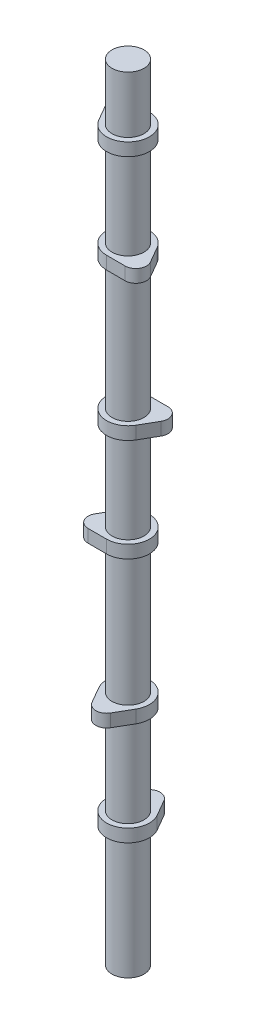
ISO-10303-21;
HEADER;
FILE_DESCRIPTION(('STEP AP214'),'2;1');
FILE_NAME('part.step','',(''),(''),'','','');
FILE_SCHEMA(('AUTOMOTIVE_DESIGN { 1 0 10303 214 1 1 1 1 }'));
ENDSEC;
DATA;
#1=APPLICATION_CONTEXT('core data for automotive mechanical design processes');
#2=APPLICATION_PROTOCOL_DEFINITION('international standard','automotive_design',2000,#1);
#3=PRODUCT_CONTEXT('',#1,'mechanical');
#4=PRODUCT('Part','Part','',(#3));
#5=PRODUCT_RELATED_PRODUCT_CATEGORY('part','',(#4));
#6=PRODUCT_DEFINITION_FORMATION('','',#4);
#7=PRODUCT_DEFINITION_CONTEXT('part definition',#1,'design');
#8=PRODUCT_DEFINITION('design','',#6,#7);
#9=PRODUCT_DEFINITION_SHAPE('','',#8);
#10=(LENGTH_UNIT() NAMED_UNIT(*) SI_UNIT(.MILLI.,.METRE.));
#11=(NAMED_UNIT(*) PLANE_ANGLE_UNIT() SI_UNIT($,.RADIAN.));
#12=(NAMED_UNIT(*) SI_UNIT($,.STERADIAN.) SOLID_ANGLE_UNIT());
#13=UNCERTAINTY_MEASURE_WITH_UNIT(LENGTH_MEASURE(1.E-05),#10,'distance_accuracy_value','');
#14=(GEOMETRIC_REPRESENTATION_CONTEXT(3) GLOBAL_UNCERTAINTY_ASSIGNED_CONTEXT((#13)) GLOBAL_UNIT_ASSIGNED_CONTEXT((#10,
#11,#12)) REPRESENTATION_CONTEXT('',''));
#15=CARTESIAN_POINT('',(0.,0.,0.));
#16=DIRECTION('',(0.,0.,1.));
#17=DIRECTION('',(1.,0.,0.));
#18=AXIS2_PLACEMENT_3D('',#15,#16,#17);
#19=CARTESIAN_POINT('',(0.,64.77,12.7));
#20=DIRECTION('',(0.,-1.,0.));
#21=DIRECTION('',(0.,0.,1.));
#22=AXIS2_PLACEMENT_3D('',#19,#20,#21);
#23=CYLINDRICAL_SURFACE('',#22,6.35);
#24=CARTESIAN_POINT('',(0.,57.15,12.7));
#25=DIRECTION('',(0.,1.,0.));
#26=DIRECTION('',(0.,0.,-1.));
#27=AXIS2_PLACEMENT_3D('',#24,#25,#26);
#28=CIRCLE('',#27,6.35);
#29=CARTESIAN_POINT('',(-5.4992613140313,57.15,15.875));
#30=VERTEX_POINT('',#29);
#31=CARTESIAN_POINT('',(5.49926131403107,57.15,15.875));
#32=VERTEX_POINT('',#31);
#33=EDGE_CURVE('E460',#30,#32,#28,.T.);
#34=ORIENTED_EDGE('',*,*,#33,.T.);
#35=DIRECTION('',(0.,-1.,0.));
#36=VECTOR('',#35,1.);
#37=CARTESIAN_POINT('',(5.49926131403107,64.77,15.875));
#38=LINE('',#37,#36);
#39=CARTESIAN_POINT('',(5.49926131403107,64.77,15.875));
#40=VERTEX_POINT('',#39);
#41=EDGE_CURVE('E490',#40,#32,#38,.T.);
#42=ORIENTED_EDGE('',*,*,#41,.F.);
#43=CARTESIAN_POINT('',(0.,64.77,12.7));
#44=DIRECTION('',(0.,1.,0.));
#45=DIRECTION('',(0.,0.,-1.));
#46=AXIS2_PLACEMENT_3D('',#43,#44,#45);
#47=CIRCLE('',#46,6.35);
#48=CARTESIAN_POINT('',(-5.4992613140313,64.77,15.875));
#49=VERTEX_POINT('',#48);
#50=EDGE_CURVE('E461',#49,#40,#47,.T.);
#51=ORIENTED_EDGE('',*,*,#50,.F.);
#52=DIRECTION('',(0.,-1.,0.));
#53=VECTOR('',#52,1.);
#54=CARTESIAN_POINT('',(-5.4992613140313,64.77,15.875));
#55=LINE('',#54,#53);
#56=EDGE_CURVE('E471',#49,#30,#55,.T.);
#57=ORIENTED_EDGE('',*,*,#56,.T.);
#58=EDGE_LOOP('',(#34,#42,#51,#57));
#59=FACE_BOUND('',#58,.T.);
#60=ADVANCED_FACE('F41',(#59),#23,.T.);
#61=CARTESIAN_POINT('',(5.49926131403107,64.77,15.875));
#62=DIRECTION('',(-0.866025403784435,0.,-0.500000000000006));
#63=DIRECTION('',(-0.500000000000006,0.,0.866025403784435));
#64=AXIS2_PLACEMENT_3D('',#61,#62,#63);
#65=PLANE('',#64);
#66=DIRECTION('',(0.500000000000006,0.,-0.866025403784435));
#67=VECTOR('',#66,1.);
#68=CARTESIAN_POINT('',(5.49926131403107,57.15,15.875));
#69=LINE('',#68,#67);
#70=CARTESIAN_POINT('',(10.9985226280623,57.15,6.35000000000008));
#71=VERTEX_POINT('',#70);
#72=EDGE_CURVE('E475',#32,#71,#69,.T.);
#73=ORIENTED_EDGE('',*,*,#72,.T.);
#74=DIRECTION('',(0.,-1.,0.));
#75=VECTOR('',#74,1.);
#76=CARTESIAN_POINT('',(10.9985226280623,64.77,6.35000000000008));
#77=LINE('',#76,#75);
#78=CARTESIAN_POINT('',(10.9985226280623,64.77,6.35000000000008));
#79=VERTEX_POINT('',#78);
#80=EDGE_CURVE('E487',#79,#71,#77,.T.);
#81=ORIENTED_EDGE('',*,*,#80,.F.);
#82=DIRECTION('',(0.500000000000006,0.,-0.866025403784435));
#83=VECTOR('',#82,1.);
#84=CARTESIAN_POINT('',(5.49926131403107,64.77,15.875));
#85=LINE('',#84,#83);
#86=EDGE_CURVE('E91',#40,#79,#85,.T.);
#87=ORIENTED_EDGE('',*,*,#86,.F.);
#88=ORIENTED_EDGE('',*,*,#41,.T.);
#89=EDGE_LOOP('',(#73,#81,#87,#88));
#90=FACE_BOUND('',#89,.T.);
#91=ADVANCED_FACE('F511',(#90),#65,.F.);
#92=CARTESIAN_POINT('',(0.,64.77,0.));
#93=DIRECTION('',(0.,-1.,0.));
#94=DIRECTION('',(0.,0.,1.));
#95=AXIS2_PLACEMENT_3D('',#92,#93,#94);
#96=CYLINDRICAL_SURFACE('',#95,12.7);
#97=CARTESIAN_POINT('',(0.,57.15,0.));
#98=DIRECTION('',(0.,1.,0.));
#99=DIRECTION('',(0.,0.,-1.));
#100=AXIS2_PLACEMENT_3D('',#97,#98,#99);
#101=CIRCLE('',#100,12.7);
#102=CARTESIAN_POINT('',(-10.9985226280624,57.15,6.34999999999992));
#103=VERTEX_POINT('',#102);
#104=EDGE_CURVE('E77',#71,#103,#101,.T.);
#105=ORIENTED_EDGE('',*,*,#104,.T.);
#106=DIRECTION('',(0.,-1.,0.));
#107=VECTOR('',#106,1.);
#108=CARTESIAN_POINT('',(-10.9985226280624,64.77,6.34999999999992));
#109=LINE('',#108,#107);
#110=CARTESIAN_POINT('',(-10.9985226280624,64.77,6.34999999999992));
#111=VERTEX_POINT('',#110);
#112=EDGE_CURVE('E484',#111,#103,#109,.T.);
#113=ORIENTED_EDGE('',*,*,#112,.F.);
#114=CARTESIAN_POINT('',(0.,64.77,0.));
#115=DIRECTION('',(0.,1.,0.));
#116=DIRECTION('',(0.,0.,-1.));
#117=AXIS2_PLACEMENT_3D('',#114,#115,#116);
#118=CIRCLE('',#117,12.7);
#119=EDGE_CURVE('E466',#79,#111,#118,.T.);
#120=ORIENTED_EDGE('',*,*,#119,.F.);
#121=ORIENTED_EDGE('',*,*,#80,.T.);
#122=EDGE_LOOP('',(#105,#113,#120,#121));
#123=FACE_BOUND('',#122,.T.);
#124=ADVANCED_FACE('F510',(#123),#96,.T.);
#125=CARTESIAN_POINT('',(-5.4992613140313,64.77,15.875));
#126=DIRECTION('',(0.866025403784442,0.,-0.499999999999994));
#127=DIRECTION('',(-0.499999999999994,0.,-0.866025403784442));
#128=AXIS2_PLACEMENT_3D('',#125,#126,#127);
#129=PLANE('',#128);
#130=DIRECTION('',(0.499999999999994,0.,0.866025403784442));
#131=VECTOR('',#130,1.);
#132=CARTESIAN_POINT('',(-5.4992613140313,57.15,15.875));
#133=LINE('',#132,#131);
#134=EDGE_CURVE('E83',#103,#30,#133,.T.);
#135=ORIENTED_EDGE('',*,*,#134,.T.);
#136=ORIENTED_EDGE('',*,*,#56,.F.);
#137=DIRECTION('',(0.499999999999994,0.,0.866025403784442));
#138=VECTOR('',#137,1.);
#139=CARTESIAN_POINT('',(-5.4992613140313,64.77,15.875));
#140=LINE('',#139,#138);
#141=EDGE_CURVE('E59',#111,#49,#140,.T.);
#142=ORIENTED_EDGE('',*,*,#141,.F.);
#143=ORIENTED_EDGE('',*,*,#112,.T.);
#144=EDGE_LOOP('',(#135,#136,#142,#143));
#145=FACE_BOUND('',#144,.T.);
#146=ADVANCED_FACE('F508',(#145),#129,.F.);
#147=CARTESIAN_POINT('',(0.,64.77,12.7));
#148=DIRECTION('',(0.,1.,0.));
#149=DIRECTION('',(0.,0.,-1.));
#150=AXIS2_PLACEMENT_3D('',#147,#148,#149);
#151=PLANE('',#150);
#152=CARTESIAN_POINT('',(0.,64.77,0.));
#153=DIRECTION('',(0.,1.,0.));
#154=DIRECTION('',(0.,0.,1.));
#155=AXIS2_PLACEMENT_3D('',#152,#153,#154);
#156=CIRCLE('',#155,9.5);
#157=CARTESIAN_POINT('',(0.,64.77,9.5));
#158=VERTEX_POINT('',#157);
#159=EDGE_CURVE('E456',#158,#158,#156,.F.);
#160=ORIENTED_EDGE('',*,*,#159,.T.);
#161=EDGE_LOOP('',(#160));
#162=FACE_BOUND('',#161,.T.);
#163=ORIENTED_EDGE('',*,*,#50,.T.);
#164=ORIENTED_EDGE('',*,*,#86,.T.);
#165=ORIENTED_EDGE('',*,*,#119,.T.);
#166=ORIENTED_EDGE('',*,*,#141,.T.);
#167=EDGE_LOOP('',(#163,#164,#165,#166));
#168=FACE_BOUND('',#167,.T.);
#169=ADVANCED_FACE('F502',(#162,#168),#151,.T.);
#170=CARTESIAN_POINT('',(0.,57.15,12.7));
#171=DIRECTION('',(0.,1.,0.));
#172=DIRECTION('',(0.,0.,-1.));
#173=AXIS2_PLACEMENT_3D('',#170,#171,#172);
#174=PLANE('',#173);
#175=CARTESIAN_POINT('',(0.,57.15,0.));
#176=DIRECTION('',(0.,1.,0.));
#177=DIRECTION('',(0.,0.,1.));
#178=AXIS2_PLACEMENT_3D('',#175,#176,#177);
#179=CIRCLE('',#178,9.5);
#180=CARTESIAN_POINT('',(0.,57.15,9.5));
#181=VERTEX_POINT('',#180);
#182=EDGE_CURVE('E51',#181,#181,#179,.F.);
#183=ORIENTED_EDGE('',*,*,#182,.F.);
#184=EDGE_LOOP('',(#183));
#185=FACE_BOUND('',#184,.T.);
#186=ORIENTED_EDGE('',*,*,#33,.F.);
#187=ORIENTED_EDGE('',*,*,#134,.F.);
#188=ORIENTED_EDGE('',*,*,#104,.F.);
#189=ORIENTED_EDGE('',*,*,#72,.F.);
#190=EDGE_LOOP('',(#186,#187,#188,#189));
#191=FACE_BOUND('',#190,.T.);
#192=ADVANCED_FACE('F499',(#185,#191),#174,.F.);
#193=CARTESIAN_POINT('',(0.,98.425,0.));
#194=DIRECTION('',(0.,-1.,0.));
#195=DIRECTION('',(0.,0.,-1.));
#196=AXIS2_PLACEMENT_3D('',#193,#194,#195);
#197=CYLINDRICAL_SURFACE('',#196,9.5);
#198=CARTESIAN_POINT('',(0.,3.80999999999999,0.));
#199=DIRECTION('',(0.,1.,0.));
#200=DIRECTION('',(0.,0.,1.));
#201=AXIS2_PLACEMENT_3D('',#198,#199,#200);
#202=CIRCLE('',#201,9.5);
#203=CARTESIAN_POINT('',(0.,3.80999999999999,9.5));
#204=VERTEX_POINT('',#203);
#205=EDGE_CURVE('E44',#204,#204,#202,.T.);
#206=ORIENTED_EDGE('',*,*,#205,.T.);
#207=EDGE_LOOP('',(#206));
#208=FACE_BOUND('',#207,.T.);
#209=ORIENTED_EDGE('',*,*,#182,.T.);
#210=EDGE_LOOP('',(#209));
#211=FACE_BOUND('',#210,.T.);
#212=ADVANCED_FACE('F497',(#208,#211),#197,.T.);
#213=ORIENTED_EDGE('',*,*,#159,.F.);
#214=EDGE_LOOP('',(#213));
#215=FACE_BOUND('',#214,.T.);
#216=CARTESIAN_POINT('',(0.,142.24,0.));
#217=DIRECTION('',(0.,1.,0.));
#218=DIRECTION('',(0.866025403784436,0.,-0.500000000000004));
#219=AXIS2_PLACEMENT_3D('',#216,#217,#218);
#220=CIRCLE('',#219,9.5);
#221=CARTESIAN_POINT('',(8.22724133595215,142.24,-4.75000000000004));
#222=VERTEX_POINT('',#221);
#223=EDGE_CURVE('E403',#222,#222,#220,.T.);
#224=ORIENTED_EDGE('',*,*,#223,.F.);
#225=EDGE_LOOP('',(#224));
#226=FACE_BOUND('',#225,.T.);
#227=ADVANCED_FACE('F524',(#215,#226),#197,.T.);
#228=CARTESIAN_POINT('',(0.,3.81,-12.7));
#229=DIRECTION('',(0.,-1.,0.));
#230=DIRECTION('',(0.,0.,-1.));
#231=AXIS2_PLACEMENT_3D('',#228,#229,#230);
#232=CYLINDRICAL_SURFACE('',#231,6.35);
#233=CARTESIAN_POINT('',(0.,-3.81,-12.7));
#234=DIRECTION('',(0.,1.,0.));
#235=DIRECTION('',(0.,0.,1.));
#236=AXIS2_PLACEMENT_3D('',#233,#234,#235);
#237=CIRCLE('',#236,6.35);
#238=CARTESIAN_POINT('',(5.49926131403118,-3.81,-15.875));
#239=VERTEX_POINT('',#238);
#240=CARTESIAN_POINT('',(-5.49926131403118,-3.81,-15.875));
#241=VERTEX_POINT('',#240);
#242=EDGE_CURVE('E414',#239,#241,#237,.T.);
#243=ORIENTED_EDGE('',*,*,#242,.T.);
#244=DIRECTION('',(0.,-1.,0.));
#245=VECTOR('',#244,1.);
#246=CARTESIAN_POINT('',(-5.49926131403118,3.81,-15.875));
#247=LINE('',#246,#245);
#248=CARTESIAN_POINT('',(-5.49926131403118,3.81,-15.875));
#249=VERTEX_POINT('',#248);
#250=EDGE_CURVE('E452',#249,#241,#247,.T.);
#251=ORIENTED_EDGE('',*,*,#250,.F.);
#252=CARTESIAN_POINT('',(0.,3.81,-12.7));
#253=DIRECTION('',(0.,1.,0.));
#254=DIRECTION('',(0.,0.,1.));
#255=AXIS2_PLACEMENT_3D('',#252,#253,#254);
#256=CIRCLE('',#255,6.35);
#257=CARTESIAN_POINT('',(5.49926131403118,3.81,-15.875));
#258=VERTEX_POINT('',#257);
#259=EDGE_CURVE('E415',#258,#249,#256,.T.);
#260=ORIENTED_EDGE('',*,*,#259,.F.);
#261=DIRECTION('',(0.,-1.,0.));
#262=VECTOR('',#261,1.);
#263=CARTESIAN_POINT('',(5.49926131403118,3.81,-15.875));
#264=LINE('',#263,#262);
#265=EDGE_CURVE('E429',#258,#239,#264,.T.);
#266=ORIENTED_EDGE('',*,*,#265,.T.);
#267=EDGE_LOOP('',(#243,#251,#260,#266));
#268=FACE_BOUND('',#267,.T.);
#269=ADVANCED_FACE('F527',(#268),#232,.T.);
#270=CARTESIAN_POINT('',(-5.49926131403118,3.81,-15.875));
#271=DIRECTION('',(0.866025403784439,0.,0.5));
#272=DIRECTION('',(0.5,0.,-0.866025403784439));
#273=AXIS2_PLACEMENT_3D('',#270,#271,#272);
#274=PLANE('',#273);
#275=DIRECTION('',(-0.5,0.,0.866025403784439));
#276=VECTOR('',#275,1.);
#277=CARTESIAN_POINT('',(-5.49926131403118,-3.81,-15.875));
#278=LINE('',#277,#276);
#279=CARTESIAN_POINT('',(-10.9985226280624,-3.81,-6.35000000000001));
#280=VERTEX_POINT('',#279);
#281=EDGE_CURVE('E433',#241,#280,#278,.T.);
#282=ORIENTED_EDGE('',*,*,#281,.T.);
#283=DIRECTION('',(0.,-1.,0.));
#284=VECTOR('',#283,1.);
#285=CARTESIAN_POINT('',(-10.9985226280624,3.81,-6.35000000000001));
#286=LINE('',#285,#284);
#287=CARTESIAN_POINT('',(-10.9985226280624,3.81,-6.35000000000001));
#288=VERTEX_POINT('',#287);
#289=EDGE_CURVE('E448',#288,#280,#286,.T.);
#290=ORIENTED_EDGE('',*,*,#289,.F.);
#291=DIRECTION('',(-0.5,0.,0.866025403784439));
#292=VECTOR('',#291,1.);
#293=CARTESIAN_POINT('',(-5.49926131403118,3.81,-15.875));
#294=LINE('',#293,#292);
#295=EDGE_CURVE('E419',#249,#288,#294,.T.);
#296=ORIENTED_EDGE('',*,*,#295,.F.);
#297=ORIENTED_EDGE('',*,*,#250,.T.);
#298=EDGE_LOOP('',(#282,#290,#296,#297));
#299=FACE_BOUND('',#298,.T.);
#300=ADVANCED_FACE('F532',(#299),#274,.F.);
#301=CARTESIAN_POINT('',(0.,3.81,0.));
#302=DIRECTION('',(0.,-1.,0.));
#303=DIRECTION('',(0.,0.,-1.));
#304=AXIS2_PLACEMENT_3D('',#301,#302,#303);
#305=CYLINDRICAL_SURFACE('',#304,12.7);
#306=CARTESIAN_POINT('',(0.,-3.81,0.));
#307=DIRECTION('',(0.,1.,0.));
#308=DIRECTION('',(0.,0.,1.));
#309=AXIS2_PLACEMENT_3D('',#306,#307,#308);
#310=CIRCLE('',#309,12.7);
#311=CARTESIAN_POINT('',(10.9985226280624,-3.81,-6.35));
#312=VERTEX_POINT('',#311);
#313=EDGE_CURVE('E436',#280,#312,#310,.T.);
#314=ORIENTED_EDGE('',*,*,#313,.T.);
#315=DIRECTION('',(0.,-1.,0.));
#316=VECTOR('',#315,1.);
#317=CARTESIAN_POINT('',(10.9985226280624,3.81,-6.35));
#318=LINE('',#317,#316);
#319=CARTESIAN_POINT('',(10.9985226280624,3.81,-6.35));
#320=VERTEX_POINT('',#319);
#321=EDGE_CURVE('E444',#320,#312,#318,.T.);
#322=ORIENTED_EDGE('',*,*,#321,.F.);
#323=CARTESIAN_POINT('',(0.,3.81,0.));
#324=DIRECTION('',(0.,1.,0.));
#325=DIRECTION('',(0.,0.,1.));
#326=AXIS2_PLACEMENT_3D('',#323,#324,#325);
#327=CIRCLE('',#326,12.7);
#328=EDGE_CURVE('E423',#288,#320,#327,.T.);
#329=ORIENTED_EDGE('',*,*,#328,.F.);
#330=ORIENTED_EDGE('',*,*,#289,.T.);
#331=EDGE_LOOP('',(#314,#322,#329,#330));
#332=FACE_BOUND('',#331,.T.);
#333=ADVANCED_FACE('F536',(#332),#305,.T.);
#334=CARTESIAN_POINT('',(5.49926131403118,3.81,-15.875));
#335=DIRECTION('',(-0.866025403784439,0.,0.5));
#336=DIRECTION('',(0.5,0.,0.866025403784439));
#337=AXIS2_PLACEMENT_3D('',#334,#335,#336);
#338=PLANE('',#337);
#339=DIRECTION('',(-0.5,0.,-0.866025403784439));
#340=VECTOR('',#339,1.);
#341=CARTESIAN_POINT('',(5.49926131403118,-3.81,-15.875));
#342=LINE('',#341,#340);
#343=EDGE_CURVE('E420',#312,#239,#342,.T.);
#344=ORIENTED_EDGE('',*,*,#343,.T.);
#345=ORIENTED_EDGE('',*,*,#265,.F.);
#346=DIRECTION('',(-0.5,0.,-0.866025403784439));
#347=VECTOR('',#346,1.);
#348=CARTESIAN_POINT('',(5.49926131403118,3.81,-15.875));
#349=LINE('',#348,#347);
#350=EDGE_CURVE('E426',#320,#258,#349,.T.);
#351=ORIENTED_EDGE('',*,*,#350,.F.);
#352=ORIENTED_EDGE('',*,*,#321,.T.);
#353=EDGE_LOOP('',(#344,#345,#351,#352));
#354=FACE_BOUND('',#353,.T.);
#355=ADVANCED_FACE('F540',(#354),#338,.F.);
#356=CARTESIAN_POINT('',(0.,3.81,-12.7));
#357=DIRECTION('',(0.,1.,0.));
#358=DIRECTION('',(0.,0.,1.));
#359=AXIS2_PLACEMENT_3D('',#356,#357,#358);
#360=PLANE('',#359);
#361=ORIENTED_EDGE('',*,*,#205,.F.);
#362=EDGE_LOOP('',(#361));
#363=FACE_BOUND('',#362,.T.);
#364=ORIENTED_EDGE('',*,*,#259,.T.);
#365=ORIENTED_EDGE('',*,*,#295,.T.);
#366=ORIENTED_EDGE('',*,*,#328,.T.);
#367=ORIENTED_EDGE('',*,*,#350,.T.);
#368=EDGE_LOOP('',(#364,#365,#366,#367));
#369=FACE_BOUND('',#368,.T.);
#370=ADVANCED_FACE('F544',(#363,#369),#360,.T.);
#371=CARTESIAN_POINT('',(0.,-3.81,-12.7));
#372=DIRECTION('',(0.,1.,0.));
#373=DIRECTION('',(0.,0.,1.));
#374=AXIS2_PLACEMENT_3D('',#371,#372,#373);
#375=PLANE('',#374);
#376=CARTESIAN_POINT('',(0.,-3.80999999999999,0.));
#377=DIRECTION('',(0.,1.,0.));
#378=DIRECTION('',(0.,0.,1.));
#379=AXIS2_PLACEMENT_3D('',#376,#377,#378);
#380=CIRCLE('',#379,9.5);
#381=CARTESIAN_POINT('',(0.,-3.80999999999999,9.5));
#382=VERTEX_POINT('',#381);
#383=EDGE_CURVE('E11',#382,#382,#380,.T.);
#384=ORIENTED_EDGE('',*,*,#383,.T.);
#385=EDGE_LOOP('',(#384));
#386=FACE_BOUND('',#385,.T.);
#387=ORIENTED_EDGE('',*,*,#242,.F.);
#388=ORIENTED_EDGE('',*,*,#343,.F.);
#389=ORIENTED_EDGE('',*,*,#313,.F.);
#390=ORIENTED_EDGE('',*,*,#281,.F.);
#391=EDGE_LOOP('',(#387,#388,#389,#390));
#392=FACE_BOUND('',#391,.T.);
#393=ADVANCED_FACE('F546',(#386,#392),#375,.F.);
#394=ORIENTED_EDGE('',*,*,#383,.F.);
#395=EDGE_LOOP('',(#394));
#396=FACE_BOUND('',#395,.T.);
#397=CARTESIAN_POINT('',(0.,-75.565,0.));
#398=DIRECTION('',(0.,-1.,0.));
#399=DIRECTION('',(0.,0.,-1.));
#400=AXIS2_PLACEMENT_3D('',#397,#398,#399);
#401=CIRCLE('',#400,9.5);
#402=CARTESIAN_POINT('',(0.,-75.565,-9.5));
#403=VERTEX_POINT('',#402);
#404=EDGE_CURVE('E407',#403,#403,#401,.T.);
#405=ORIENTED_EDGE('',*,*,#404,.F.);
#406=EDGE_LOOP('',(#405));
#407=FACE_BOUND('',#406,.T.);
#408=ADVANCED_FACE('F529',(#396,#407),#197,.T.);
#409=CARTESIAN_POINT('',(0.,-75.565,0.));
#410=DIRECTION('',(0.,-1.,0.));
#411=DIRECTION('',(0.,0.,-1.));
#412=AXIS2_PLACEMENT_3D('',#409,#410,#411);
#413=PLANE('',#412);
#414=ORIENTED_EDGE('',*,*,#404,.T.);
#415=EDGE_LOOP('',(#414));
#416=FACE_BOUND('',#415,.T.);
#417=ADVANCED_FACE('F553',(#416),#413,.T.);
#418=CARTESIAN_POINT('',(10.9985226280624,210.82,-6.34999999999997));
#419=DIRECTION('',(0.,-1.,0.));
#420=DIRECTION('',(0.86602540378444,0.,-0.499999999999998));
#421=AXIS2_PLACEMENT_3D('',#418,#419,#420);
#422=CYLINDRICAL_SURFACE('',#421,6.35);
#423=CARTESIAN_POINT('',(10.9985226280624,203.2,-6.34999999999997));
#424=DIRECTION('',(0.,1.,0.));
#425=DIRECTION('',(-0.86602540378444,0.,0.499999999999998));
#426=AXIS2_PLACEMENT_3D('',#423,#424,#425);
#427=CIRCLE('',#426,6.35);
#428=CARTESIAN_POINT('',(16.4977839420936,203.2,-3.17499999999996));
#429=VERTEX_POINT('',#428);
#430=CARTESIAN_POINT('',(10.9985226280624,203.2,-12.7));
#431=VERTEX_POINT('',#430);
#432=EDGE_CURVE('E357',#429,#431,#427,.T.);
#433=ORIENTED_EDGE('',*,*,#432,.T.);
#434=DIRECTION('',(0.,-1.,0.));
#435=VECTOR('',#434,1.);
#436=CARTESIAN_POINT('',(10.9985226280624,210.82,-12.7));
#437=LINE('',#436,#435);
#438=CARTESIAN_POINT('',(10.9985226280624,210.82,-12.7));
#439=VERTEX_POINT('',#438);
#440=EDGE_CURVE('E395',#439,#431,#437,.T.);
#441=ORIENTED_EDGE('',*,*,#440,.F.);
#442=CARTESIAN_POINT('',(10.9985226280624,210.82,-6.34999999999997));
#443=DIRECTION('',(0.,1.,0.));
#444=DIRECTION('',(-0.86602540378444,0.,0.499999999999998));
#445=AXIS2_PLACEMENT_3D('',#442,#443,#444);
#446=CIRCLE('',#445,6.35);
#447=CARTESIAN_POINT('',(16.4977839420936,210.82,-3.17499999999996));
#448=VERTEX_POINT('',#447);
#449=EDGE_CURVE('E358',#448,#439,#446,.T.);
#450=ORIENTED_EDGE('',*,*,#449,.F.);
#451=DIRECTION('',(0.,-1.,0.));
#452=VECTOR('',#451,1.);
#453=CARTESIAN_POINT('',(16.4977839420936,210.82,-3.17499999999996));
#454=LINE('',#453,#452);
#455=EDGE_CURVE('E372',#448,#429,#454,.T.);
#456=ORIENTED_EDGE('',*,*,#455,.T.);
#457=EDGE_LOOP('',(#433,#441,#450,#456));
#458=FACE_BOUND('',#457,.T.);
#459=ADVANCED_FACE('F556',(#458),#422,.T.);
#460=CARTESIAN_POINT('',(10.9985226280624,210.82,-12.7));
#461=DIRECTION('',(0.,0.,1.));
#462=DIRECTION('',(1.,0.,0.));
#463=AXIS2_PLACEMENT_3D('',#460,#461,#462);
#464=PLANE('',#463);
#465=DIRECTION('',(-1.,0.,0.));
#466=VECTOR('',#465,1.);
#467=CARTESIAN_POINT('',(10.9985226280624,203.2,-12.7));
#468=LINE('',#467,#466);
#469=CARTESIAN_POINT('',(0.,203.2,-12.7));
#470=VERTEX_POINT('',#469);
#471=EDGE_CURVE('E376',#431,#470,#468,.T.);
#472=ORIENTED_EDGE('',*,*,#471,.T.);
#473=DIRECTION('',(0.,-1.,0.));
#474=VECTOR('',#473,1.);
#475=CARTESIAN_POINT('',(0.,210.82,-12.7));
#476=LINE('',#475,#474);
#477=CARTESIAN_POINT('',(0.,210.82,-12.7));
#478=VERTEX_POINT('',#477);
#479=EDGE_CURVE('E391',#478,#470,#476,.T.);
#480=ORIENTED_EDGE('',*,*,#479,.F.);
#481=DIRECTION('',(-1.,0.,0.));
#482=VECTOR('',#481,1.);
#483=CARTESIAN_POINT('',(10.9985226280624,210.82,-12.7));
#484=LINE('',#483,#482);
#485=EDGE_CURVE('E362',#439,#478,#484,.T.);
#486=ORIENTED_EDGE('',*,*,#485,.F.);
#487=ORIENTED_EDGE('',*,*,#440,.T.);
#488=EDGE_LOOP('',(#472,#480,#486,#487));
#489=FACE_BOUND('',#488,.T.);
#490=ADVANCED_FACE('F560',(#489),#464,.F.);
#491=CARTESIAN_POINT('',(0.,210.82,0.));
#492=DIRECTION('',(0.,-1.,0.));
#493=DIRECTION('',(0.86602540378444,0.,-0.499999999999998));
#494=AXIS2_PLACEMENT_3D('',#491,#492,#493);
#495=CYLINDRICAL_SURFACE('',#494,12.7);
#496=CARTESIAN_POINT('',(0.,203.2,0.));
#497=DIRECTION('',(0.,1.,0.));
#498=DIRECTION('',(-0.86602540378444,0.,0.499999999999998));
#499=AXIS2_PLACEMENT_3D('',#496,#497,#498);
#500=CIRCLE('',#499,12.7);
#501=CARTESIAN_POINT('',(10.9985226280624,203.2,6.35000000000003));
#502=VERTEX_POINT('',#501);
#503=EDGE_CURVE('E379',#470,#502,#500,.T.);
#504=ORIENTED_EDGE('',*,*,#503,.T.);
#505=DIRECTION('',(0.,-1.,0.));
#506=VECTOR('',#505,1.);
#507=CARTESIAN_POINT('',(10.9985226280624,210.82,6.35000000000003));
#508=LINE('',#507,#506);
#509=CARTESIAN_POINT('',(10.9985226280624,210.82,6.35000000000003));
#510=VERTEX_POINT('',#509);
#511=EDGE_CURVE('E387',#510,#502,#508,.T.);
#512=ORIENTED_EDGE('',*,*,#511,.F.);
#513=CARTESIAN_POINT('',(0.,210.82,0.));
#514=DIRECTION('',(0.,1.,0.));
#515=DIRECTION('',(-0.86602540378444,0.,0.499999999999998));
#516=AXIS2_PLACEMENT_3D('',#513,#514,#515);
#517=CIRCLE('',#516,12.7);
#518=EDGE_CURVE('E366',#478,#510,#517,.T.);
#519=ORIENTED_EDGE('',*,*,#518,.F.);
#520=ORIENTED_EDGE('',*,*,#479,.T.);
#521=EDGE_LOOP('',(#504,#512,#519,#520));
#522=FACE_BOUND('',#521,.T.);
#523=ADVANCED_FACE('F564',(#522),#495,.T.);
#524=CARTESIAN_POINT('',(16.4977839420936,210.82,-3.17499999999996));
#525=DIRECTION('',(-0.866025403784438,0.,-0.500000000000002));
#526=DIRECTION('',(-0.500000000000002,0.,0.866025403784438));
#527=AXIS2_PLACEMENT_3D('',#524,#525,#526);
#528=PLANE('',#527);
#529=DIRECTION('',(0.500000000000002,0.,-0.866025403784438));
#530=VECTOR('',#529,1.);
#531=CARTESIAN_POINT('',(16.4977839420936,203.2,-3.17499999999996));
#532=LINE('',#531,#530);
#533=EDGE_CURVE('E363',#502,#429,#532,.T.);
#534=ORIENTED_EDGE('',*,*,#533,.T.);
#535=ORIENTED_EDGE('',*,*,#455,.F.);
#536=DIRECTION('',(0.500000000000002,0.,-0.866025403784438));
#537=VECTOR('',#536,1.);
#538=CARTESIAN_POINT('',(16.4977839420936,210.82,-3.17499999999996));
#539=LINE('',#538,#537);
#540=EDGE_CURVE('E369',#510,#448,#539,.T.);
#541=ORIENTED_EDGE('',*,*,#540,.F.);
#542=ORIENTED_EDGE('',*,*,#511,.T.);
#543=EDGE_LOOP('',(#534,#535,#541,#542));
#544=FACE_BOUND('',#543,.T.);
#545=ADVANCED_FACE('F568',(#544),#528,.F.);
#546=CARTESIAN_POINT('',(10.9985226280624,210.82,-6.34999999999997));
#547=DIRECTION('',(0.,1.,0.));
#548=DIRECTION('',(-0.86602540378444,0.,0.499999999999998));
#549=AXIS2_PLACEMENT_3D('',#546,#547,#548);
#550=PLANE('',#549);
#551=CARTESIAN_POINT('',(0.,210.82,0.));
#552=DIRECTION('',(0.,1.,0.));
#553=DIRECTION('',(0.866025403784436,0.,-0.500000000000004));
#554=AXIS2_PLACEMENT_3D('',#551,#552,#553);
#555=CIRCLE('',#554,9.5);
#556=CARTESIAN_POINT('',(8.22724133595215,210.82,-4.75000000000004));
#557=VERTEX_POINT('',#556);
#558=EDGE_CURVE('E353',#557,#557,#555,.F.);
#559=ORIENTED_EDGE('',*,*,#558,.T.);
#560=EDGE_LOOP('',(#559));
#561=FACE_BOUND('',#560,.T.);
#562=ORIENTED_EDGE('',*,*,#449,.T.);
#563=ORIENTED_EDGE('',*,*,#485,.T.);
#564=ORIENTED_EDGE('',*,*,#518,.T.);
#565=ORIENTED_EDGE('',*,*,#540,.T.);
#566=EDGE_LOOP('',(#562,#563,#564,#565));
#567=FACE_BOUND('',#566,.T.);
#568=ADVANCED_FACE('F572',(#561,#567),#550,.T.);
#569=CARTESIAN_POINT('',(10.9985226280624,203.2,-6.34999999999997));
#570=DIRECTION('',(0.,1.,0.));
#571=DIRECTION('',(-0.86602540378444,0.,0.499999999999998));
#572=AXIS2_PLACEMENT_3D('',#569,#570,#571);
#573=PLANE('',#572);
#574=CARTESIAN_POINT('',(0.,203.2,0.));
#575=DIRECTION('',(0.,1.,0.));
#576=DIRECTION('',(0.866025403784436,0.,-0.500000000000004));
#577=AXIS2_PLACEMENT_3D('',#574,#575,#576);
#578=CIRCLE('',#577,9.5);
#579=CARTESIAN_POINT('',(8.22724133595215,203.2,-4.75000000000004));
#580=VERTEX_POINT('',#579);
#581=EDGE_CURVE('E399',#580,#580,#578,.F.);
#582=ORIENTED_EDGE('',*,*,#581,.F.);
#583=EDGE_LOOP('',(#582));
#584=FACE_BOUND('',#583,.T.);
#585=ORIENTED_EDGE('',*,*,#432,.F.);
#586=ORIENTED_EDGE('',*,*,#533,.F.);
#587=ORIENTED_EDGE('',*,*,#503,.F.);
#588=ORIENTED_EDGE('',*,*,#471,.F.);
#589=EDGE_LOOP('',(#585,#586,#587,#588));
#590=FACE_BOUND('',#589,.T.);
#591=ADVANCED_FACE('F574',(#584,#590),#573,.F.);
#592=CARTESIAN_POINT('',(0.,244.475,0.));
#593=DIRECTION('',(0.,-1.,0.));
#594=DIRECTION('',(-0.866025403784436,0.,0.500000000000004));
#595=AXIS2_PLACEMENT_3D('',#592,#593,#594);
#596=CYLINDRICAL_SURFACE('',#595,9.5);
#597=CARTESIAN_POINT('',(0.,149.86,0.));
#598=DIRECTION('',(0.,1.,0.));
#599=DIRECTION('',(0.866025403784436,0.,-0.500000000000004));
#600=AXIS2_PLACEMENT_3D('',#597,#598,#599);
#601=CIRCLE('',#600,9.5);
#602=CARTESIAN_POINT('',(8.22724133595215,149.86,-4.75000000000004));
#603=VERTEX_POINT('',#602);
#604=EDGE_CURVE('E352',#603,#603,#601,.T.);
#605=ORIENTED_EDGE('',*,*,#604,.T.);
#606=EDGE_LOOP('',(#605));
#607=FACE_BOUND('',#606,.T.);
#608=ORIENTED_EDGE('',*,*,#581,.T.);
#609=EDGE_LOOP('',(#608));
#610=FACE_BOUND('',#609,.T.);
#611=ADVANCED_FACE('F577',(#607,#610),#596,.T.);
#612=ORIENTED_EDGE('',*,*,#558,.F.);
#613=EDGE_LOOP('',(#612));
#614=FACE_BOUND('',#613,.T.);
#615=CARTESIAN_POINT('',(0.,288.29,0.));
#616=DIRECTION('',(0.,1.,0.));
#617=DIRECTION('',(-0.866025403784443,0.,-0.499999999999992));
#618=AXIS2_PLACEMENT_3D('',#615,#616,#617);
#619=CIRCLE('',#618,9.5);
#620=CARTESIAN_POINT('',(-8.22724133595221,288.29,-4.74999999999992));
#621=VERTEX_POINT('',#620);
#622=EDGE_CURVE('E306',#621,#621,#619,.T.);
#623=ORIENTED_EDGE('',*,*,#622,.F.);
#624=EDGE_LOOP('',(#623));
#625=FACE_BOUND('',#624,.T.);
#626=ADVANCED_FACE('F582',(#614,#625),#596,.T.);
#627=CARTESIAN_POINT('',(-10.9985226280623,149.86,6.35000000000005));
#628=DIRECTION('',(0.,-1.,0.));
#629=DIRECTION('',(-0.866025403784436,0.,0.500000000000004));
#630=AXIS2_PLACEMENT_3D('',#627,#628,#629);
#631=CYLINDRICAL_SURFACE('',#630,6.35);
#632=CARTESIAN_POINT('',(-10.9985226280623,142.24,6.35000000000005));
#633=DIRECTION('',(0.,1.,0.));
#634=DIRECTION('',(0.866025403784436,0.,-0.500000000000004));
#635=AXIS2_PLACEMENT_3D('',#632,#633,#634);
#636=CIRCLE('',#635,6.35);
#637=CARTESIAN_POINT('',(-16.4977839420935,142.24,3.17500000000008));
#638=VERTEX_POINT('',#637);
#639=CARTESIAN_POINT('',(-10.9985226280623,142.24,12.7000000000001));
#640=VERTEX_POINT('',#639);
#641=EDGE_CURVE('E309',#638,#640,#636,.T.);
#642=ORIENTED_EDGE('',*,*,#641,.T.);
#643=DIRECTION('',(0.,-1.,0.));
#644=VECTOR('',#643,1.);
#645=CARTESIAN_POINT('',(-10.9985226280623,149.86,12.7000000000001));
#646=LINE('',#645,#644);
#647=CARTESIAN_POINT('',(-10.9985226280623,149.86,12.7000000000001));
#648=VERTEX_POINT('',#647);
#649=EDGE_CURVE('E348',#648,#640,#646,.T.);
#650=ORIENTED_EDGE('',*,*,#649,.F.);
#651=CARTESIAN_POINT('',(-10.9985226280623,149.86,6.35000000000005));
#652=DIRECTION('',(0.,1.,0.));
#653=DIRECTION('',(0.866025403784436,0.,-0.500000000000004));
#654=AXIS2_PLACEMENT_3D('',#651,#652,#653);
#655=CIRCLE('',#654,6.35);
#656=CARTESIAN_POINT('',(-16.4977839420935,149.86,3.17500000000008));
#657=VERTEX_POINT('',#656);
#658=EDGE_CURVE('E311',#657,#648,#655,.T.);
#659=ORIENTED_EDGE('',*,*,#658,.F.);
#660=DIRECTION('',(0.,-1.,0.));
#661=VECTOR('',#660,1.);
#662=CARTESIAN_POINT('',(-16.4977839420935,149.86,3.17500000000008));
#663=LINE('',#662,#661);
#664=EDGE_CURVE('E325',#657,#638,#663,.T.);
#665=ORIENTED_EDGE('',*,*,#664,.T.);
#666=EDGE_LOOP('',(#642,#650,#659,#665));
#667=FACE_BOUND('',#666,.T.);
#668=ADVANCED_FACE('F585',(#667),#631,.T.);
#669=CARTESIAN_POINT('',(-10.9985226280623,149.86,12.7000000000001));
#670=DIRECTION('',(0.,0.,-1.));
#671=DIRECTION('',(-1.,0.,0.));
#672=AXIS2_PLACEMENT_3D('',#669,#670,#671);
#673=PLANE('',#672);
#674=DIRECTION('',(1.,0.,0.));
#675=VECTOR('',#674,1.);
#676=CARTESIAN_POINT('',(-10.9985226280623,142.24,12.7000000000001));
#677=LINE('',#676,#675);
#678=CARTESIAN_POINT('',(0.,142.24,12.7));
#679=VERTEX_POINT('',#678);
#680=EDGE_CURVE('E329',#640,#679,#677,.T.);
#681=ORIENTED_EDGE('',*,*,#680,.T.);
#682=DIRECTION('',(0.,-1.,0.));
#683=VECTOR('',#682,1.);
#684=CARTESIAN_POINT('',(0.,149.86,12.7));
#685=LINE('',#684,#683);
#686=CARTESIAN_POINT('',(0.,149.86,12.7));
#687=VERTEX_POINT('',#686);
#688=EDGE_CURVE('E344',#687,#679,#685,.T.);
#689=ORIENTED_EDGE('',*,*,#688,.F.);
#690=DIRECTION('',(1.,0.,0.));
#691=VECTOR('',#690,1.);
#692=CARTESIAN_POINT('',(-10.9985226280623,149.86,12.7000000000001));
#693=LINE('',#692,#691);
#694=EDGE_CURVE('E315',#648,#687,#693,.T.);
#695=ORIENTED_EDGE('',*,*,#694,.F.);
#696=ORIENTED_EDGE('',*,*,#649,.T.);
#697=EDGE_LOOP('',(#681,#689,#695,#696));
#698=FACE_BOUND('',#697,.T.);
#699=ADVANCED_FACE('F589',(#698),#673,.F.);
#700=CARTESIAN_POINT('',(0.,149.86,0.));
#701=DIRECTION('',(0.,-1.,0.));
#702=DIRECTION('',(-0.866025403784436,0.,0.500000000000004));
#703=AXIS2_PLACEMENT_3D('',#700,#701,#702);
#704=CYLINDRICAL_SURFACE('',#703,12.7);
#705=CARTESIAN_POINT('',(0.,142.24,0.));
#706=DIRECTION('',(0.,1.,0.));
#707=DIRECTION('',(0.866025403784436,0.,-0.500000000000004));
#708=AXIS2_PLACEMENT_3D('',#705,#706,#707);
#709=CIRCLE('',#708,12.7);
#710=CARTESIAN_POINT('',(-10.9985226280624,142.24,-6.34999999999995));
#711=VERTEX_POINT('',#710);
#712=EDGE_CURVE('E332',#679,#711,#709,.T.);
#713=ORIENTED_EDGE('',*,*,#712,.T.);
#714=DIRECTION('',(0.,-1.,0.));
#715=VECTOR('',#714,1.);
#716=CARTESIAN_POINT('',(-10.9985226280624,149.86,-6.34999999999995));
#717=LINE('',#716,#715);
#718=CARTESIAN_POINT('',(-10.9985226280624,149.86,-6.34999999999995));
#719=VERTEX_POINT('',#718);
#720=EDGE_CURVE('E340',#719,#711,#717,.T.);
#721=ORIENTED_EDGE('',*,*,#720,.F.);
#722=CARTESIAN_POINT('',(0.,149.86,0.));
#723=DIRECTION('',(0.,1.,0.));
#724=DIRECTION('',(0.866025403784436,0.,-0.500000000000004));
#725=AXIS2_PLACEMENT_3D('',#722,#723,#724);
#726=CIRCLE('',#725,12.7);
#727=EDGE_CURVE('E319',#687,#719,#726,.T.);
#728=ORIENTED_EDGE('',*,*,#727,.F.);
#729=ORIENTED_EDGE('',*,*,#688,.T.);
#730=EDGE_LOOP('',(#713,#721,#728,#729));
#731=FACE_BOUND('',#730,.T.);
#732=ADVANCED_FACE('F593',(#731),#704,.T.);
#733=CARTESIAN_POINT('',(-16.4977839420935,149.86,3.17500000000008));
#734=DIRECTION('',(0.866025403784441,0.,0.499999999999996));
#735=DIRECTION('',(0.499999999999996,0.,-0.866025403784441));
#736=AXIS2_PLACEMENT_3D('',#733,#734,#735);
#737=PLANE('',#736);
#738=DIRECTION('',(-0.499999999999996,0.,0.866025403784441));
#739=VECTOR('',#738,1.);
#740=CARTESIAN_POINT('',(-16.4977839420935,142.24,3.17500000000008));
#741=LINE('',#740,#739);
#742=EDGE_CURVE('E316',#711,#638,#741,.T.);
#743=ORIENTED_EDGE('',*,*,#742,.T.);
#744=ORIENTED_EDGE('',*,*,#664,.F.);
#745=DIRECTION('',(-0.499999999999996,0.,0.866025403784441));
#746=VECTOR('',#745,1.);
#747=CARTESIAN_POINT('',(-16.4977839420935,149.86,3.17500000000008));
#748=LINE('',#747,#746);
#749=EDGE_CURVE('E322',#719,#657,#748,.T.);
#750=ORIENTED_EDGE('',*,*,#749,.F.);
#751=ORIENTED_EDGE('',*,*,#720,.T.);
#752=EDGE_LOOP('',(#743,#744,#750,#751));
#753=FACE_BOUND('',#752,.T.);
#754=ADVANCED_FACE('F597',(#753),#737,.F.);
#755=CARTESIAN_POINT('',(-10.9985226280623,149.86,6.35000000000005));
#756=DIRECTION('',(0.,1.,0.));
#757=DIRECTION('',(0.866025403784436,0.,-0.500000000000004));
#758=AXIS2_PLACEMENT_3D('',#755,#756,#757);
#759=PLANE('',#758);
#760=ORIENTED_EDGE('',*,*,#604,.F.);
#761=EDGE_LOOP('',(#760));
#762=FACE_BOUND('',#761,.T.);
#763=ORIENTED_EDGE('',*,*,#658,.T.);
#764=ORIENTED_EDGE('',*,*,#694,.T.);
#765=ORIENTED_EDGE('',*,*,#727,.T.);
#766=ORIENTED_EDGE('',*,*,#749,.T.);
#767=EDGE_LOOP('',(#763,#764,#765,#766));
#768=FACE_BOUND('',#767,.T.);
#769=ADVANCED_FACE('F601',(#762,#768),#759,.T.);
#770=CARTESIAN_POINT('',(-10.9985226280623,142.24,6.35000000000005));
#771=DIRECTION('',(0.,1.,0.));
#772=DIRECTION('',(0.866025403784436,0.,-0.500000000000004));
#773=AXIS2_PLACEMENT_3D('',#770,#771,#772);
#774=PLANE('',#773);
#775=ORIENTED_EDGE('',*,*,#223,.T.);
#776=EDGE_LOOP('',(#775));
#777=FACE_BOUND('',#776,.T.);
#778=ORIENTED_EDGE('',*,*,#641,.F.);
#779=ORIENTED_EDGE('',*,*,#742,.F.);
#780=ORIENTED_EDGE('',*,*,#712,.F.);
#781=ORIENTED_EDGE('',*,*,#680,.F.);
#782=EDGE_LOOP('',(#778,#779,#780,#781));
#783=FACE_BOUND('',#782,.T.);
#784=ADVANCED_FACE('F603',(#777,#783),#774,.F.);
#785=CARTESIAN_POINT('',(-10.9985226280624,356.87,-6.34999999999997));
#786=DIRECTION('',(0.,-1.,0.));
#787=DIRECTION('',(-0.86602540378444,0.,-0.499999999999998));
#788=AXIS2_PLACEMENT_3D('',#785,#786,#787);
#789=CYLINDRICAL_SURFACE('',#788,6.35);
#790=CARTESIAN_POINT('',(-10.9985226280624,349.25,-6.34999999999997));
#791=DIRECTION('',(0.,1.,0.));
#792=DIRECTION('',(0.86602540378444,0.,0.499999999999998));
#793=AXIS2_PLACEMENT_3D('',#790,#791,#792);
#794=CIRCLE('',#793,6.35);
#795=CARTESIAN_POINT('',(-10.9985226280624,349.25,-12.7));
#796=VERTEX_POINT('',#795);
#797=CARTESIAN_POINT('',(-16.4977839420936,349.25,-3.17499999999996));
#798=VERTEX_POINT('',#797);
#799=EDGE_CURVE('E260',#796,#798,#794,.T.);
#800=ORIENTED_EDGE('',*,*,#799,.T.);
#801=DIRECTION('',(0.,-1.,0.));
#802=VECTOR('',#801,1.);
#803=CARTESIAN_POINT('',(-16.4977839420936,356.87,-3.17499999999996));
#804=LINE('',#803,#802);
#805=CARTESIAN_POINT('',(-16.4977839420936,356.87,-3.17499999999996));
#806=VERTEX_POINT('',#805);
#807=EDGE_CURVE('E298',#806,#798,#804,.T.);
#808=ORIENTED_EDGE('',*,*,#807,.F.);
#809=CARTESIAN_POINT('',(-10.9985226280624,356.87,-6.34999999999997));
#810=DIRECTION('',(0.,1.,0.));
#811=DIRECTION('',(0.86602540378444,0.,0.499999999999998));
#812=AXIS2_PLACEMENT_3D('',#809,#810,#811);
#813=CIRCLE('',#812,6.35);
#814=CARTESIAN_POINT('',(-10.9985226280624,356.87,-12.7));
#815=VERTEX_POINT('',#814);
#816=EDGE_CURVE('E261',#815,#806,#813,.T.);
#817=ORIENTED_EDGE('',*,*,#816,.F.);
#818=DIRECTION('',(0.,-1.,0.));
#819=VECTOR('',#818,1.);
#820=CARTESIAN_POINT('',(-10.9985226280624,356.87,-12.7));
#821=LINE('',#820,#819);
#822=EDGE_CURVE('E275',#815,#796,#821,.T.);
#823=ORIENTED_EDGE('',*,*,#822,.T.);
#824=EDGE_LOOP('',(#800,#808,#817,#823));
#825=FACE_BOUND('',#824,.T.);
#826=ADVANCED_FACE('F606',(#825),#789,.T.);
#827=CARTESIAN_POINT('',(-16.4977839420936,356.87,-3.17499999999996));
#828=DIRECTION('',(0.866025403784437,0.,-0.500000000000002));
#829=DIRECTION('',(-0.500000000000002,0.,-0.866025403784437));
#830=AXIS2_PLACEMENT_3D('',#827,#828,#829);
#831=PLANE('',#830);
#832=DIRECTION('',(0.500000000000002,0.,0.866025403784437));
#833=VECTOR('',#832,1.);
#834=CARTESIAN_POINT('',(-16.4977839420936,349.25,-3.17499999999996));
#835=LINE('',#834,#833);
#836=CARTESIAN_POINT('',(-10.9985226280624,349.25,6.35000000000002));
#837=VERTEX_POINT('',#836);
#838=EDGE_CURVE('E279',#798,#837,#835,.T.);
#839=ORIENTED_EDGE('',*,*,#838,.T.);
#840=DIRECTION('',(0.,-1.,0.));
#841=VECTOR('',#840,1.);
#842=CARTESIAN_POINT('',(-10.9985226280624,356.87,6.35000000000002));
#843=LINE('',#842,#841);
#844=CARTESIAN_POINT('',(-10.9985226280624,356.87,6.35000000000002));
#845=VERTEX_POINT('',#844);
#846=EDGE_CURVE('E294',#845,#837,#843,.T.);
#847=ORIENTED_EDGE('',*,*,#846,.F.);
#848=DIRECTION('',(0.500000000000002,0.,0.866025403784437));
#849=VECTOR('',#848,1.);
#850=CARTESIAN_POINT('',(-16.4977839420936,356.87,-3.17499999999996));
#851=LINE('',#850,#849);
#852=EDGE_CURVE('E265',#806,#845,#851,.T.);
#853=ORIENTED_EDGE('',*,*,#852,.F.);
#854=ORIENTED_EDGE('',*,*,#807,.T.);
#855=EDGE_LOOP('',(#839,#847,#853,#854));
#856=FACE_BOUND('',#855,.T.);
#857=ADVANCED_FACE('F613',(#856),#831,.F.);
#858=CARTESIAN_POINT('',(0.,356.87,0.));
#859=DIRECTION('',(0.,-1.,0.));
#860=DIRECTION('',(-0.86602540378444,0.,-0.499999999999998));
#861=AXIS2_PLACEMENT_3D('',#858,#859,#860);
#862=CYLINDRICAL_SURFACE('',#861,12.7);
#863=CARTESIAN_POINT('',(0.,349.25,0.));
#864=DIRECTION('',(0.,1.,0.));
#865=DIRECTION('',(0.86602540378444,0.,0.499999999999998));
#866=AXIS2_PLACEMENT_3D('',#863,#864,#865);
#867=CIRCLE('',#866,12.7);
#868=CARTESIAN_POINT('',(0.,349.25,-12.7));
#869=VERTEX_POINT('',#868);
#870=EDGE_CURVE('E282',#837,#869,#867,.T.);
#871=ORIENTED_EDGE('',*,*,#870,.T.);
#872=DIRECTION('',(0.,-1.,0.));
#873=VECTOR('',#872,1.);
#874=CARTESIAN_POINT('',(0.,356.87,-12.7));
#875=LINE('',#874,#873);
#876=CARTESIAN_POINT('',(0.,356.87,-12.7));
#877=VERTEX_POINT('',#876);
#878=EDGE_CURVE('E290',#877,#869,#875,.T.);
#879=ORIENTED_EDGE('',*,*,#878,.F.);
#880=CARTESIAN_POINT('',(0.,356.87,0.));
#881=DIRECTION('',(0.,1.,0.));
#882=DIRECTION('',(0.86602540378444,0.,0.499999999999998));
#883=AXIS2_PLACEMENT_3D('',#880,#881,#882);
#884=CIRCLE('',#883,12.7);
#885=EDGE_CURVE('E269',#845,#877,#884,.T.);
#886=ORIENTED_EDGE('',*,*,#885,.F.);
#887=ORIENTED_EDGE('',*,*,#846,.T.);
#888=EDGE_LOOP('',(#871,#879,#886,#887));
#889=FACE_BOUND('',#888,.T.);
#890=ADVANCED_FACE('F617',(#889),#862,.T.);
#891=CARTESIAN_POINT('',(-10.9985226280624,356.87,-12.7));
#892=DIRECTION('',(0.,0.,1.));
#893=DIRECTION('',(1.,0.,0.));
#894=AXIS2_PLACEMENT_3D('',#891,#892,#893);
#895=PLANE('',#894);
#896=DIRECTION('',(-1.,0.,0.));
#897=VECTOR('',#896,1.);
#898=CARTESIAN_POINT('',(-10.9985226280624,349.25,-12.7));
#899=LINE('',#898,#897);
#900=EDGE_CURVE('E266',#869,#796,#899,.T.);
#901=ORIENTED_EDGE('',*,*,#900,.T.);
#902=ORIENTED_EDGE('',*,*,#822,.F.);
#903=DIRECTION('',(-1.,0.,0.));
#904=VECTOR('',#903,1.);
#905=CARTESIAN_POINT('',(-10.9985226280624,356.87,-12.7));
#906=LINE('',#905,#904);
#907=EDGE_CURVE('E272',#877,#815,#906,.T.);
#908=ORIENTED_EDGE('',*,*,#907,.F.);
#909=ORIENTED_EDGE('',*,*,#878,.T.);
#910=EDGE_LOOP('',(#901,#902,#908,#909));
#911=FACE_BOUND('',#910,.T.);
#912=ADVANCED_FACE('F621',(#911),#895,.F.);
#913=CARTESIAN_POINT('',(-10.9985226280624,356.87,-6.34999999999997));
#914=DIRECTION('',(0.,1.,0.));
#915=DIRECTION('',(0.86602540378444,0.,0.499999999999998));
#916=AXIS2_PLACEMENT_3D('',#913,#914,#915);
#917=PLANE('',#916);
#918=CARTESIAN_POINT('',(0.,356.87,0.));
#919=DIRECTION('',(0.,1.,0.));
#920=DIRECTION('',(-0.866025403784443,0.,-0.499999999999992));
#921=AXIS2_PLACEMENT_3D('',#918,#919,#920);
#922=CIRCLE('',#921,9.5);
#923=CARTESIAN_POINT('',(-8.22724133595221,356.87,-4.74999999999992));
#924=VERTEX_POINT('',#923);
#925=EDGE_CURVE('E256',#924,#924,#922,.F.);
#926=ORIENTED_EDGE('',*,*,#925,.T.);
#927=EDGE_LOOP('',(#926));
#928=FACE_BOUND('',#927,.T.);
#929=ORIENTED_EDGE('',*,*,#816,.T.);
#930=ORIENTED_EDGE('',*,*,#852,.T.);
#931=ORIENTED_EDGE('',*,*,#885,.T.);
#932=ORIENTED_EDGE('',*,*,#907,.T.);
#933=EDGE_LOOP('',(#929,#930,#931,#932));
#934=FACE_BOUND('',#933,.T.);
#935=ADVANCED_FACE('F625',(#928,#934),#917,.T.);
#936=CARTESIAN_POINT('',(-10.9985226280624,349.25,-6.34999999999997));
#937=DIRECTION('',(0.,1.,0.));
#938=DIRECTION('',(0.86602540378444,0.,0.499999999999998));
#939=AXIS2_PLACEMENT_3D('',#936,#937,#938);
#940=PLANE('',#939);
#941=CARTESIAN_POINT('',(0.,349.25,0.));
#942=DIRECTION('',(0.,1.,0.));
#943=DIRECTION('',(-0.866025403784443,0.,-0.499999999999992));
#944=AXIS2_PLACEMENT_3D('',#941,#942,#943);
#945=CIRCLE('',#944,9.5);
#946=CARTESIAN_POINT('',(-8.22724133595221,349.25,-4.74999999999992));
#947=VERTEX_POINT('',#946);
#948=EDGE_CURVE('E302',#947,#947,#945,.F.);
#949=ORIENTED_EDGE('',*,*,#948,.F.);
#950=EDGE_LOOP('',(#949));
#951=FACE_BOUND('',#950,.T.);
#952=ORIENTED_EDGE('',*,*,#799,.F.);
#953=ORIENTED_EDGE('',*,*,#900,.F.);
#954=ORIENTED_EDGE('',*,*,#870,.F.);
#955=ORIENTED_EDGE('',*,*,#838,.F.);
#956=EDGE_LOOP('',(#952,#953,#954,#955));
#957=FACE_BOUND('',#956,.T.);
#958=ADVANCED_FACE('F627',(#951,#957),#940,.F.);
#959=CARTESIAN_POINT('',(0.,390.525,0.));
#960=DIRECTION('',(0.,-1.,0.));
#961=DIRECTION('',(0.866025403784443,0.,0.499999999999992));
#962=AXIS2_PLACEMENT_3D('',#959,#960,#961);
#963=CYLINDRICAL_SURFACE('',#962,9.5);
#964=CARTESIAN_POINT('',(0.,295.91,0.));
#965=DIRECTION('',(0.,1.,0.));
#966=DIRECTION('',(-0.866025403784443,0.,-0.499999999999992));
#967=AXIS2_PLACEMENT_3D('',#964,#965,#966);
#968=CIRCLE('',#967,9.5);
#969=CARTESIAN_POINT('',(-8.22724133595221,295.91,-4.74999999999992));
#970=VERTEX_POINT('',#969);
#971=EDGE_CURVE('E242',#970,#970,#968,.T.);
#972=ORIENTED_EDGE('',*,*,#971,.T.);
#973=EDGE_LOOP('',(#972));
#974=FACE_BOUND('',#973,.T.);
#975=ORIENTED_EDGE('',*,*,#948,.T.);
#976=EDGE_LOOP('',(#975));
#977=FACE_BOUND('',#976,.T.);
#978=ADVANCED_FACE('F630',(#974,#977),#963,.T.);
#979=ORIENTED_EDGE('',*,*,#925,.F.);
#980=EDGE_LOOP('',(#979));
#981=FACE_BOUND('',#980,.T.);
#982=CARTESIAN_POINT('',(0.,390.525,0.));
#983=DIRECTION('',(0.,1.,0.));
#984=DIRECTION('',(-0.866025403784443,0.,-0.499999999999992));
#985=AXIS2_PLACEMENT_3D('',#982,#983,#984);
#986=CIRCLE('',#985,9.5);
#987=CARTESIAN_POINT('',(-8.22724133595221,390.525,-4.74999999999992));
#988=VERTEX_POINT('',#987);
#989=EDGE_CURVE('E247',#988,#988,#986,.T.);
#990=ORIENTED_EDGE('',*,*,#989,.F.);
#991=EDGE_LOOP('',(#990));
#992=FACE_BOUND('',#991,.T.);
#993=ADVANCED_FACE('F635',(#981,#992),#963,.T.);
#994=CARTESIAN_POINT('',(0.,390.525,0.));
#995=DIRECTION('',(0.,1.,0.));
#996=DIRECTION('',(-0.866025403784443,0.,-0.499999999999992));
#997=AXIS2_PLACEMENT_3D('',#994,#995,#996);
#998=PLANE('',#997);
#999=ORIENTED_EDGE('',*,*,#989,.T.);
#1000=EDGE_LOOP('',(#999));
#1001=FACE_BOUND('',#1000,.T.);
#1002=ADVANCED_FACE('F638',(#1001),#998,.T.);
#1003=CARTESIAN_POINT('',(10.9985226280624,295.91,6.3499999999999));
#1004=DIRECTION('',(0.,-1.,0.));
#1005=DIRECTION('',(0.866025403784443,0.,0.499999999999992));
#1006=AXIS2_PLACEMENT_3D('',#1003,#1004,#1005);
#1007=CYLINDRICAL_SURFACE('',#1006,6.35);
#1008=CARTESIAN_POINT('',(10.9985226280624,288.29,6.3499999999999));
#1009=DIRECTION('',(0.,1.,0.));
#1010=DIRECTION('',(-0.866025403784443,0.,-0.499999999999992));
#1011=AXIS2_PLACEMENT_3D('',#1008,#1009,#1010);
#1012=CIRCLE('',#1011,6.35);
#1013=CARTESIAN_POINT('',(10.9985226280625,288.29,12.6999999999999));
#1014=VERTEX_POINT('',#1013);
#1015=CARTESIAN_POINT('',(16.4977839420936,288.29,3.17499999999985));
#1016=VERTEX_POINT('',#1015);
#1017=EDGE_CURVE('E240',#1014,#1016,#1012,.T.);
#1018=ORIENTED_EDGE('',*,*,#1017,.T.);
#1019=DIRECTION('',(0.,-1.,0.));
#1020=VECTOR('',#1019,1.);
#1021=CARTESIAN_POINT('',(16.4977839420936,295.91,3.17499999999985));
#1022=LINE('',#1021,#1020);
#1023=CARTESIAN_POINT('',(16.4977839420936,295.91,3.17499999999985));
#1024=VERTEX_POINT('',#1023);
#1025=EDGE_CURVE('E218',#1024,#1016,#1022,.T.);
#1026=ORIENTED_EDGE('',*,*,#1025,.F.);
#1027=CARTESIAN_POINT('',(10.9985226280624,295.91,6.3499999999999));
#1028=DIRECTION('',(0.,1.,0.));
#1029=DIRECTION('',(-0.866025403784443,0.,-0.499999999999992));
#1030=AXIS2_PLACEMENT_3D('',#1027,#1028,#1029);
#1031=CIRCLE('',#1030,6.35);
#1032=CARTESIAN_POINT('',(10.9985226280625,295.91,12.6999999999999));
#1033=VERTEX_POINT('',#1032);
#1034=EDGE_CURVE('E226',#1033,#1024,#1031,.T.);
#1035=ORIENTED_EDGE('',*,*,#1034,.F.);
#1036=DIRECTION('',(0.,-1.,0.));
#1037=VECTOR('',#1036,1.);
#1038=CARTESIAN_POINT('',(10.9985226280625,295.91,12.6999999999999));
#1039=LINE('',#1038,#1037);
#1040=EDGE_CURVE('E1053',#1033,#1014,#1039,.T.);
#1041=ORIENTED_EDGE('',*,*,#1040,.T.);
#1042=EDGE_LOOP('',(#1018,#1026,#1035,#1041));
#1043=FACE_BOUND('',#1042,.T.);
#1044=ADVANCED_FACE('F238',(#1043),#1007,.T.);
#1045=CARTESIAN_POINT('',(16.4977839420936,295.91,3.17499999999985));
#1046=DIRECTION('',(-0.866025403784434,0.,0.500000000000008));
#1047=DIRECTION('',(0.500000000000008,0.,0.866025403784434));
#1048=AXIS2_PLACEMENT_3D('',#1045,#1046,#1047);
#1049=PLANE('',#1048);
#1050=DIRECTION('',(-0.500000000000008,0.,-0.866025403784434));
#1051=VECTOR('',#1050,1.);
#1052=CARTESIAN_POINT('',(16.4977839420936,288.29,3.17499999999985));
#1053=LINE('',#1052,#1051);
#1054=CARTESIAN_POINT('',(10.9985226280623,288.29,-6.3500000000001));
#1055=VERTEX_POINT('',#1054);
#1056=EDGE_CURVE('E1040',#1016,#1055,#1053,.T.);
#1057=ORIENTED_EDGE('',*,*,#1056,.T.);
#1058=DIRECTION('',(0.,-1.,0.));
#1059=VECTOR('',#1058,1.);
#1060=CARTESIAN_POINT('',(10.9985226280623,295.91,-6.3500000000001));
#1061=LINE('',#1060,#1059);
#1062=CARTESIAN_POINT('',(10.9985226280623,295.91,-6.3500000000001));
#1063=VERTEX_POINT('',#1062);
#1064=EDGE_CURVE('E221',#1063,#1055,#1061,.T.);
#1065=ORIENTED_EDGE('',*,*,#1064,.F.);
#1066=DIRECTION('',(-0.500000000000008,0.,-0.866025403784434));
#1067=VECTOR('',#1066,1.);
#1068=CARTESIAN_POINT('',(16.4977839420936,295.91,3.17499999999985));
#1069=LINE('',#1068,#1067);
#1070=EDGE_CURVE('E214',#1024,#1063,#1069,.T.);
#1071=ORIENTED_EDGE('',*,*,#1070,.F.);
#1072=ORIENTED_EDGE('',*,*,#1025,.T.);
#1073=EDGE_LOOP('',(#1057,#1065,#1071,#1072));
#1074=FACE_BOUND('',#1073,.T.);
#1075=ADVANCED_FACE('F216',(#1074),#1049,.F.);
#1076=CARTESIAN_POINT('',(0.,295.91,0.));
#1077=DIRECTION('',(0.,-1.,0.));
#1078=DIRECTION('',(0.866025403784443,0.,0.499999999999992));
#1079=AXIS2_PLACEMENT_3D('',#1076,#1077,#1078);
#1080=CYLINDRICAL_SURFACE('',#1079,12.7);
#1081=CARTESIAN_POINT('',(0.,288.29,0.));
#1082=DIRECTION('',(0.,1.,0.));
#1083=DIRECTION('',(-0.866025403784443,0.,-0.499999999999992));
#1084=AXIS2_PLACEMENT_3D('',#1081,#1082,#1083);
#1085=CIRCLE('',#1084,12.7);
#1086=CARTESIAN_POINT('',(1.17961196366423E-13,288.29,12.7));
#1087=VERTEX_POINT('',#1086);
#1088=EDGE_CURVE('E1044',#1055,#1087,#1085,.T.);
#1089=ORIENTED_EDGE('',*,*,#1088,.T.);
#1090=DIRECTION('',(0.,-1.,0.));
#1091=VECTOR('',#1090,1.);
#1092=CARTESIAN_POINT('',(1.17961196366423E-13,295.91,12.7));
#1093=LINE('',#1092,#1091);
#1094=CARTESIAN_POINT('',(1.17961196366423E-13,295.91,12.7));
#1095=VERTEX_POINT('',#1094);
#1096=EDGE_CURVE('E249',#1095,#1087,#1093,.T.);
#1097=ORIENTED_EDGE('',*,*,#1096,.F.);
#1098=CARTESIAN_POINT('',(0.,295.91,0.));
#1099=DIRECTION('',(0.,1.,0.));
#1100=DIRECTION('',(-0.866025403784443,0.,-0.499999999999992));
#1101=AXIS2_PLACEMENT_3D('',#1098,#1099,#1100);
#1102=CIRCLE('',#1101,12.7);
#1103=EDGE_CURVE('E225',#1063,#1095,#1102,.T.);
#1104=ORIENTED_EDGE('',*,*,#1103,.F.);
#1105=ORIENTED_EDGE('',*,*,#1064,.T.);
#1106=EDGE_LOOP('',(#1089,#1097,#1104,#1105));
#1107=FACE_BOUND('',#1106,.T.);
#1108=ADVANCED_FACE('F647',(#1107),#1080,.T.);
#1109=CARTESIAN_POINT('',(10.9985226280625,295.91,12.6999999999999));
#1110=DIRECTION('',(0.,0.,-1.));
#1111=DIRECTION('',(-1.,0.,0.));
#1112=AXIS2_PLACEMENT_3D('',#1109,#1110,#1111);
#1113=PLANE('',#1112);
#1114=DIRECTION('',(1.,0.,0.));
#1115=VECTOR('',#1114,1.);
#1116=CARTESIAN_POINT('',(10.9985226280625,288.29,12.6999999999999));
#1117=LINE('',#1116,#1115);
#1118=EDGE_CURVE('E236',#1087,#1014,#1117,.T.);
#1119=ORIENTED_EDGE('',*,*,#1118,.T.);
#1120=ORIENTED_EDGE('',*,*,#1040,.F.);
#1121=DIRECTION('',(1.,0.,0.));
#1122=VECTOR('',#1121,1.);
#1123=CARTESIAN_POINT('',(10.9985226280625,295.91,12.6999999999999));
#1124=LINE('',#1123,#1122);
#1125=EDGE_CURVE('E231',#1095,#1033,#1124,.T.);
#1126=ORIENTED_EDGE('',*,*,#1125,.F.);
#1127=ORIENTED_EDGE('',*,*,#1096,.T.);
#1128=EDGE_LOOP('',(#1119,#1120,#1126,#1127));
#1129=FACE_BOUND('',#1128,.T.);
#1130=ADVANCED_FACE('F650',(#1129),#1113,.F.);
#1131=CARTESIAN_POINT('',(10.9985226280624,295.91,6.3499999999999));
#1132=DIRECTION('',(0.,1.,0.));
#1133=DIRECTION('',(-0.866025403784443,0.,-0.499999999999992));
#1134=AXIS2_PLACEMENT_3D('',#1131,#1132,#1133);
#1135=PLANE('',#1134);
#1136=ORIENTED_EDGE('',*,*,#971,.F.);
#1137=EDGE_LOOP('',(#1136));
#1138=FACE_BOUND('',#1137,.T.);
#1139=ORIENTED_EDGE('',*,*,#1034,.T.);
#1140=ORIENTED_EDGE('',*,*,#1070,.T.);
#1141=ORIENTED_EDGE('',*,*,#1103,.T.);
#1142=ORIENTED_EDGE('',*,*,#1125,.T.);
#1143=EDGE_LOOP('',(#1139,#1140,#1141,#1142));
#1144=FACE_BOUND('',#1143,.T.);
#1145=ADVANCED_FACE('F229',(#1138,#1144),#1135,.T.);
#1146=CARTESIAN_POINT('',(10.9985226280624,288.29,6.3499999999999));
#1147=DIRECTION('',(0.,1.,0.));
#1148=DIRECTION('',(-0.866025403784443,0.,-0.499999999999992));
#1149=AXIS2_PLACEMENT_3D('',#1146,#1147,#1148);
#1150=PLANE('',#1149);
#1151=ORIENTED_EDGE('',*,*,#622,.T.);
#1152=EDGE_LOOP('',(#1151));
#1153=FACE_BOUND('',#1152,.T.);
#1154=ORIENTED_EDGE('',*,*,#1017,.F.);
#1155=ORIENTED_EDGE('',*,*,#1118,.F.);
#1156=ORIENTED_EDGE('',*,*,#1088,.F.);
#1157=ORIENTED_EDGE('',*,*,#1056,.F.);
#1158=EDGE_LOOP('',(#1154,#1155,#1156,#1157));
#1159=FACE_BOUND('',#1158,.T.);
#1160=ADVANCED_FACE('F655',(#1153,#1159),#1150,.F.);
#1161=CLOSED_SHELL('',(#60,#91,#124,#146,#169,#192,#212,#227,#269,#300,#333,#355,#370,#393,#408,
#417,#459,#490,#523,#545,#568,#591,#611,#626,#668,#699,#732,#754,#769,#784,#826,#857,#890,#912,
#935,#958,#978,#993,#1002,#1044,#1075,#1108,#1130,#1145,#1160));
#1162=MANIFOLD_SOLID_BREP('B2',#1161);
#1163=ADVANCED_BREP_SHAPE_REPRESENTATION('',(#18,#1162),#14);
#1164=SHAPE_DEFINITION_REPRESENTATION(#9,#1163);
ENDSEC;
END-ISO-10303-21;
